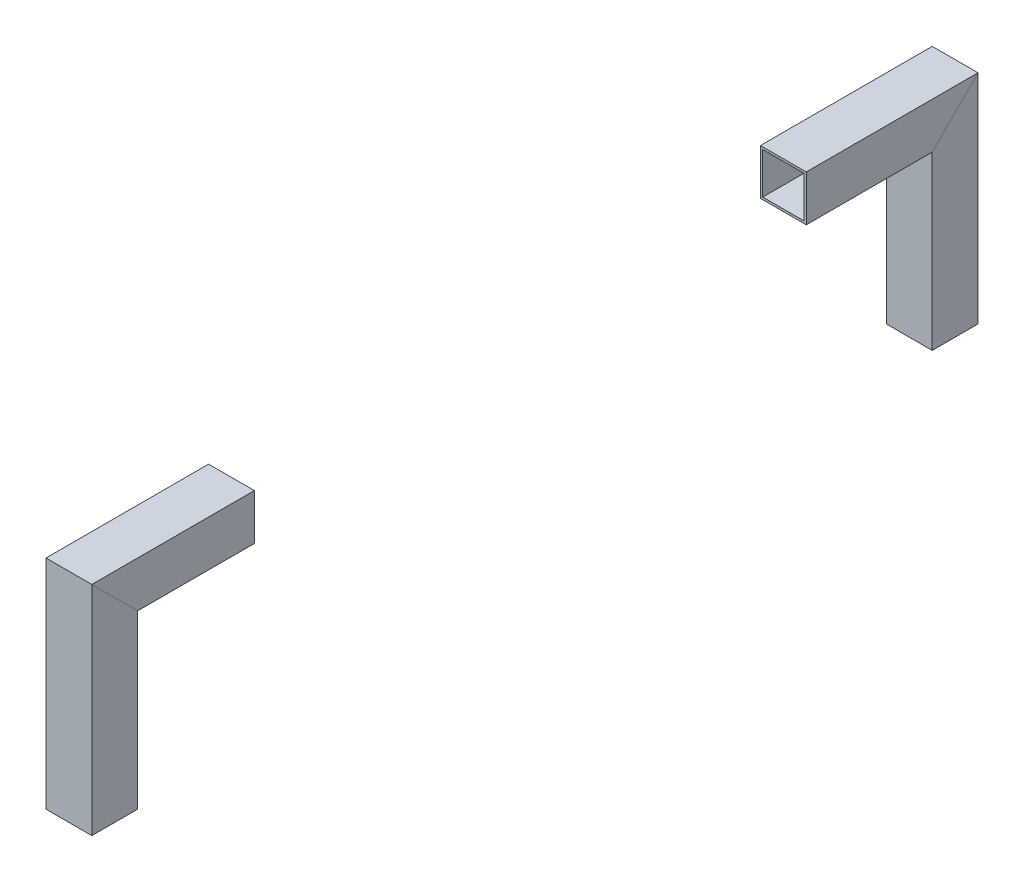
ISO-10303-21;
HEADER;
FILE_DESCRIPTION(('STEP AP214'),'2;1');
FILE_NAME('part.step','',(''),(''),'','','');
FILE_SCHEMA(('AUTOMOTIVE_DESIGN { 1 0 10303 214 1 1 1 1 }'));
ENDSEC;
DATA;
#1=APPLICATION_CONTEXT('core data for automotive mechanical design processes');
#2=APPLICATION_PROTOCOL_DEFINITION('international standard','automotive_design',2000,#1);
#3=PRODUCT_CONTEXT('',#1,'mechanical');
#4=PRODUCT('Part','Part','',(#3));
#5=PRODUCT_RELATED_PRODUCT_CATEGORY('part','',(#4));
#6=PRODUCT_DEFINITION_FORMATION('','',#4);
#7=PRODUCT_DEFINITION_CONTEXT('part definition',#1,'design');
#8=PRODUCT_DEFINITION('design','',#6,#7);
#9=PRODUCT_DEFINITION_SHAPE('','',#8);
#10=(LENGTH_UNIT() NAMED_UNIT(*) SI_UNIT(.MILLI.,.METRE.));
#11=(NAMED_UNIT(*) PLANE_ANGLE_UNIT() SI_UNIT($,.RADIAN.));
#12=(NAMED_UNIT(*) SI_UNIT($,.STERADIAN.) SOLID_ANGLE_UNIT());
#13=UNCERTAINTY_MEASURE_WITH_UNIT(LENGTH_MEASURE(1.E-05),#10,'distance_accuracy_value','');
#14=(GEOMETRIC_REPRESENTATION_CONTEXT(3) GLOBAL_UNCERTAINTY_ASSIGNED_CONTEXT((#13)) GLOBAL_UNIT_ASSIGNED_CONTEXT((#10,
#11,#12)) REPRESENTATION_CONTEXT('',''));
#15=CARTESIAN_POINT('',(0.,0.,0.));
#16=DIRECTION('',(0.,0.,1.));
#17=DIRECTION('',(1.,0.,0.));
#18=AXIS2_PLACEMENT_3D('',#15,#16,#17);
#19=CARTESIAN_POINT('',(-10.,95.,-367.));
#20=DIRECTION('',(0.,-1.,0.));
#21=DIRECTION('',(0.,0.,-1.));
#22=AXIS2_PLACEMENT_3D('',#19,#20,#21);
#23=PLANE('',#22);
#24=DIRECTION('',(0.,0.,1.));
#25=VECTOR('',#24,1.);
#26=CARTESIAN_POINT('',(10.,95.,-367.));
#27=LINE('',#26,#25);
#28=CARTESIAN_POINT('',(10.,95.,-61.));
#29=VERTEX_POINT('',#28);
#30=CARTESIAN_POINT('',(10.,95.,9.99999999999995));
#31=VERTEX_POINT('',#30);
#32=EDGE_CURVE('E163',#29,#31,#27,.T.);
#33=ORIENTED_EDGE('',*,*,#32,.F.);
#34=DIRECTION('',(1.,0.,0.));
#35=VECTOR('',#34,1.);
#36=CARTESIAN_POINT('',(-10.,95.,-61.));
#37=LINE('',#36,#35);
#38=CARTESIAN_POINT('',(-10.,95.,-61.));
#39=VERTEX_POINT('',#38);
#40=EDGE_CURVE('E13',#39,#29,#37,.T.);
#41=ORIENTED_EDGE('',*,*,#40,.F.);
#42=DIRECTION('',(0.,0.,1.));
#43=VECTOR('',#42,1.);
#44=CARTESIAN_POINT('',(-10.,95.,-367.));
#45=LINE('',#44,#43);
#46=CARTESIAN_POINT('',(-10.,95.,9.99999999999995));
#47=VERTEX_POINT('',#46);
#48=EDGE_CURVE('E66',#39,#47,#45,.T.);
#49=ORIENTED_EDGE('',*,*,#48,.T.);
#50=DIRECTION('',(-1.,0.,0.));
#51=VECTOR('',#50,1.);
#52=CARTESIAN_POINT('',(-10.,95.,9.99999999999995));
#53=LINE('',#52,#51);
#54=EDGE_CURVE('E188',#31,#47,#53,.T.);
#55=ORIENTED_EDGE('',*,*,#54,.F.);
#56=EDGE_LOOP('',(#33,#41,#49,#55));
#57=FACE_BOUND('',#56,.T.);
#58=ADVANCED_FACE('F62',(#57),#23,.F.);
#59=CARTESIAN_POINT('',(10.,75.,-367.));
#60=DIRECTION('',(-1.,0.,0.));
#61=DIRECTION('',(0.,0.,1.));
#62=AXIS2_PLACEMENT_3D('',#59,#60,#61);
#63=PLANE('',#62);
#64=DIRECTION('',(0.,0.,1.));
#65=VECTOR('',#64,1.);
#66=CARTESIAN_POINT('',(10.,75.,-367.));
#67=LINE('',#66,#65);
#68=CARTESIAN_POINT('',(10.,75.,-61.));
#69=VERTEX_POINT('',#68);
#70=CARTESIAN_POINT('',(10.,75.,-10.));
#71=VERTEX_POINT('',#70);
#72=EDGE_CURVE('E166',#69,#71,#67,.T.);
#73=ORIENTED_EDGE('',*,*,#72,.F.);
#74=DIRECTION('',(0.,-1.,0.));
#75=VECTOR('',#74,1.);
#76=CARTESIAN_POINT('',(10.,75.,-61.));
#77=LINE('',#76,#75);
#78=EDGE_CURVE('E72',#29,#69,#77,.T.);
#79=ORIENTED_EDGE('',*,*,#78,.F.);
#80=ORIENTED_EDGE('',*,*,#32,.T.);
#81=DIRECTION('',(0.,0.707106781186548,0.707106781186547));
#82=VECTOR('',#81,1.);
#83=CARTESIAN_POINT('',(10.,-103.5,-188.5));
#84=LINE('',#83,#82);
#85=EDGE_CURVE('E134',#71,#31,#84,.T.);
#86=ORIENTED_EDGE('',*,*,#85,.F.);
#87=EDGE_LOOP('',(#73,#79,#80,#86));
#88=FACE_BOUND('',#87,.T.);
#89=ADVANCED_FACE('F217',(#88),#63,.F.);
#90=CARTESIAN_POINT('',(-10.,75.,-367.));
#91=DIRECTION('',(0.,1.,0.));
#92=DIRECTION('',(0.,0.,1.));
#93=AXIS2_PLACEMENT_3D('',#90,#91,#92);
#94=PLANE('',#93);
#95=DIRECTION('',(0.,0.,1.));
#96=VECTOR('',#95,1.);
#97=CARTESIAN_POINT('',(-10.,75.,-367.));
#98=LINE('',#97,#96);
#99=CARTESIAN_POINT('',(-10.,75.,-61.));
#100=VERTEX_POINT('',#99);
#101=CARTESIAN_POINT('',(-10.,75.,-10.0000000000001));
#102=VERTEX_POINT('',#101);
#103=EDGE_CURVE('E162',#100,#102,#98,.T.);
#104=ORIENTED_EDGE('',*,*,#103,.F.);
#105=DIRECTION('',(1.,0.,0.));
#106=VECTOR('',#105,1.);
#107=CARTESIAN_POINT('',(-10.,75.,-61.));
#108=LINE('',#107,#106);
#109=EDGE_CURVE('E165',#100,#69,#108,.T.);
#110=ORIENTED_EDGE('',*,*,#109,.T.);
#111=ORIENTED_EDGE('',*,*,#72,.T.);
#112=DIRECTION('',(1.,0.,0.));
#113=VECTOR('',#112,1.);
#114=CARTESIAN_POINT('',(-10.,75.,-10.0000000000001));
#115=LINE('',#114,#113);
#116=EDGE_CURVE('E178',#102,#71,#115,.T.);
#117=ORIENTED_EDGE('',*,*,#116,.F.);
#118=EDGE_LOOP('',(#104,#110,#111,#117));
#119=FACE_BOUND('',#118,.T.);
#120=ADVANCED_FACE('F175',(#119),#94,.F.);
#121=CARTESIAN_POINT('',(-10.,75.,-367.));
#122=DIRECTION('',(1.,0.,0.));
#123=DIRECTION('',(0.,0.,-1.));
#124=AXIS2_PLACEMENT_3D('',#121,#122,#123);
#125=PLANE('',#124);
#126=ORIENTED_EDGE('',*,*,#48,.F.);
#127=DIRECTION('',(0.,-1.,0.));
#128=VECTOR('',#127,1.);
#129=CARTESIAN_POINT('',(-10.,75.,-61.));
#130=LINE('',#129,#128);
#131=EDGE_CURVE('E154',#39,#100,#130,.T.);
#132=ORIENTED_EDGE('',*,*,#131,.T.);
#133=ORIENTED_EDGE('',*,*,#103,.T.);
#134=DIRECTION('',(0.,-0.707106781186548,-0.707106781186547));
#135=VECTOR('',#134,1.);
#136=CARTESIAN_POINT('',(-10.,-103.5,-188.5));
#137=LINE('',#136,#135);
#138=EDGE_CURVE('E183',#47,#102,#137,.T.);
#139=ORIENTED_EDGE('',*,*,#138,.F.);
#140=EDGE_LOOP('',(#126,#132,#133,#139));
#141=FACE_BOUND('',#140,.T.);
#142=ADVANCED_FACE('F173',(#141),#125,.F.);
#143=CARTESIAN_POINT('',(-9.,94.,-367.));
#144=DIRECTION('',(0.,-1.,0.));
#145=DIRECTION('',(0.,0.,-1.));
#146=AXIS2_PLACEMENT_3D('',#143,#144,#145);
#147=PLANE('',#146);
#148=DIRECTION('',(-1.,0.,0.));
#149=VECTOR('',#148,1.);
#150=CARTESIAN_POINT('',(-9.,94.,-61.));
#151=LINE('',#150,#149);
#152=CARTESIAN_POINT('',(9.,94.,-61.));
#153=VERTEX_POINT('',#152);
#154=CARTESIAN_POINT('',(-9.,94.,-61.));
#155=VERTEX_POINT('',#154);
#156=EDGE_CURVE('E127',#153,#155,#151,.T.);
#157=ORIENTED_EDGE('',*,*,#156,.F.);
#158=DIRECTION('',(0.,0.,1.));
#159=VECTOR('',#158,1.);
#160=CARTESIAN_POINT('',(9.,94.,-367.));
#161=LINE('',#160,#159);
#162=CARTESIAN_POINT('',(9.,94.,9.00000000000001));
#163=VERTEX_POINT('',#162);
#164=EDGE_CURVE('E150',#153,#163,#161,.T.);
#165=ORIENTED_EDGE('',*,*,#164,.T.);
#166=DIRECTION('',(-1.,0.,0.));
#167=VECTOR('',#166,1.);
#168=CARTESIAN_POINT('',(-9.,94.,9.00000000000001));
#169=LINE('',#168,#167);
#170=CARTESIAN_POINT('',(-9.,94.,9.00000000000001));
#171=VERTEX_POINT('',#170);
#172=EDGE_CURVE('E146',#163,#171,#169,.T.);
#173=ORIENTED_EDGE('',*,*,#172,.T.);
#174=DIRECTION('',(0.,0.,1.));
#175=VECTOR('',#174,1.);
#176=CARTESIAN_POINT('',(-9.,94.,-367.));
#177=LINE('',#176,#175);
#178=EDGE_CURVE('E140',#155,#171,#177,.T.);
#179=ORIENTED_EDGE('',*,*,#178,.F.);
#180=EDGE_LOOP('',(#157,#165,#173,#179));
#181=FACE_BOUND('',#180,.T.);
#182=ADVANCED_FACE('F64',(#181),#147,.T.);
#183=CARTESIAN_POINT('',(-9.,76.,-367.));
#184=DIRECTION('',(1.,0.,0.));
#185=DIRECTION('',(0.,0.,-1.));
#186=AXIS2_PLACEMENT_3D('',#183,#184,#185);
#187=PLANE('',#186);
#188=DIRECTION('',(0.,-1.,0.));
#189=VECTOR('',#188,1.);
#190=CARTESIAN_POINT('',(-9.,76.,-61.));
#191=LINE('',#190,#189);
#192=CARTESIAN_POINT('',(-9.,76.,-61.));
#193=VERTEX_POINT('',#192);
#194=EDGE_CURVE('E130',#155,#193,#191,.T.);
#195=ORIENTED_EDGE('',*,*,#194,.F.);
#196=ORIENTED_EDGE('',*,*,#178,.T.);
#197=DIRECTION('',(0.,-0.707106781186548,-0.707106781186547));
#198=VECTOR('',#197,1.);
#199=CARTESIAN_POINT('',(-9.,-103.,-188.));
#200=LINE('',#199,#198);
#201=CARTESIAN_POINT('',(-9.,76.,-9.00000000000006));
#202=VERTEX_POINT('',#201);
#203=EDGE_CURVE('E147',#171,#202,#200,.T.);
#204=ORIENTED_EDGE('',*,*,#203,.T.);
#205=DIRECTION('',(0.,0.,1.));
#206=VECTOR('',#205,1.);
#207=CARTESIAN_POINT('',(-9.,76.,-367.));
#208=LINE('',#207,#206);
#209=EDGE_CURVE('E142',#193,#202,#208,.T.);
#210=ORIENTED_EDGE('',*,*,#209,.F.);
#211=EDGE_LOOP('',(#195,#196,#204,#210));
#212=FACE_BOUND('',#211,.T.);
#213=ADVANCED_FACE('F138',(#212),#187,.T.);
#214=CARTESIAN_POINT('',(-9.,76.,-367.));
#215=DIRECTION('',(0.,1.,0.));
#216=DIRECTION('',(0.,0.,1.));
#217=AXIS2_PLACEMENT_3D('',#214,#215,#216);
#218=PLANE('',#217);
#219=DIRECTION('',(1.,0.,0.));
#220=VECTOR('',#219,1.);
#221=CARTESIAN_POINT('',(-9.,76.,-61.));
#222=LINE('',#221,#220);
#223=CARTESIAN_POINT('',(9.,76.,-61.));
#224=VERTEX_POINT('',#223);
#225=EDGE_CURVE('E100',#193,#224,#222,.T.);
#226=ORIENTED_EDGE('',*,*,#225,.F.);
#227=ORIENTED_EDGE('',*,*,#209,.T.);
#228=DIRECTION('',(1.,0.,0.));
#229=VECTOR('',#228,1.);
#230=CARTESIAN_POINT('',(-9.,76.,-9.00000000000001));
#231=LINE('',#230,#229);
#232=CARTESIAN_POINT('',(9.,76.,-9.00000000000001));
#233=VERTEX_POINT('',#232);
#234=EDGE_CURVE('E157',#202,#233,#231,.T.);
#235=ORIENTED_EDGE('',*,*,#234,.T.);
#236=DIRECTION('',(0.,0.,1.));
#237=VECTOR('',#236,1.);
#238=CARTESIAN_POINT('',(9.,76.,-367.));
#239=LINE('',#238,#237);
#240=EDGE_CURVE('E158',#224,#233,#239,.T.);
#241=ORIENTED_EDGE('',*,*,#240,.F.);
#242=EDGE_LOOP('',(#226,#227,#235,#241));
#243=FACE_BOUND('',#242,.T.);
#244=ADVANCED_FACE('F202',(#243),#218,.T.);
#245=CARTESIAN_POINT('',(9.,76.,-367.));
#246=DIRECTION('',(-1.,0.,0.));
#247=DIRECTION('',(0.,0.,1.));
#248=AXIS2_PLACEMENT_3D('',#245,#246,#247);
#249=PLANE('',#248);
#250=DIRECTION('',(0.,1.,0.));
#251=VECTOR('',#250,1.);
#252=CARTESIAN_POINT('',(9.,76.,-61.));
#253=LINE('',#252,#251);
#254=EDGE_CURVE('E94',#224,#153,#253,.T.);
#255=ORIENTED_EDGE('',*,*,#254,.F.);
#256=ORIENTED_EDGE('',*,*,#240,.T.);
#257=DIRECTION('',(0.,0.707106781186548,0.707106781186547));
#258=VECTOR('',#257,1.);
#259=CARTESIAN_POINT('',(9.,-103.,-188.));
#260=LINE('',#259,#258);
#261=EDGE_CURVE('E160',#233,#163,#260,.T.);
#262=ORIENTED_EDGE('',*,*,#261,.T.);
#263=ORIENTED_EDGE('',*,*,#164,.F.);
#264=EDGE_LOOP('',(#255,#256,#262,#263));
#265=FACE_BOUND('',#264,.T.);
#266=ADVANCED_FACE('F206',(#265),#249,.T.);
#267=CARTESIAN_POINT('',(0.,85.,0.));
#268=DIRECTION('',(0.,-0.707106781186547,0.707106781186548));
#269=DIRECTION('',(0.,-0.707106781186548,-0.707106781186547));
#270=AXIS2_PLACEMENT_3D('',#267,#268,#269);
#271=PLANE('',#270);
#272=ORIENTED_EDGE('',*,*,#261,.F.);
#273=ORIENTED_EDGE('',*,*,#234,.F.);
#274=ORIENTED_EDGE('',*,*,#203,.F.);
#275=ORIENTED_EDGE('',*,*,#172,.F.);
#276=EDGE_LOOP('',(#272,#273,#274,#275));
#277=FACE_BOUND('',#276,.T.);
#278=ORIENTED_EDGE('',*,*,#54,.T.);
#279=ORIENTED_EDGE('',*,*,#138,.T.);
#280=ORIENTED_EDGE('',*,*,#116,.T.);
#281=ORIENTED_EDGE('',*,*,#85,.T.);
#282=EDGE_LOOP('',(#278,#279,#280,#281));
#283=FACE_BOUND('',#282,.T.);
#284=ADVANCED_FACE('F186',(#277,#283),#271,.T.);
#285=CARTESIAN_POINT('',(-10.,75.,-61.));
#286=DIRECTION('',(0.,0.,1.));
#287=DIRECTION('',(1.,0.,0.));
#288=AXIS2_PLACEMENT_3D('',#285,#286,#287);
#289=PLANE('',#288);
#290=ORIENTED_EDGE('',*,*,#156,.T.);
#291=ORIENTED_EDGE('',*,*,#194,.T.);
#292=ORIENTED_EDGE('',*,*,#225,.T.);
#293=ORIENTED_EDGE('',*,*,#254,.T.);
#294=EDGE_LOOP('',(#290,#291,#292,#293));
#295=FACE_BOUND('',#294,.T.);
#296=ORIENTED_EDGE('',*,*,#78,.T.);
#297=ORIENTED_EDGE('',*,*,#109,.F.);
#298=ORIENTED_EDGE('',*,*,#131,.F.);
#299=ORIENTED_EDGE('',*,*,#40,.T.);
#300=EDGE_LOOP('',(#296,#297,#298,#299));
#301=FACE_BOUND('',#300,.T.);
#302=ADVANCED_FACE('F129',(#295,#301),#289,.F.);
#303=CLOSED_SHELL('',(#58,#89,#120,#142,#182,#213,#244,#266,#284,#302));
#304=MANIFOLD_SOLID_BREP('B2',#303);
#305=CARTESIAN_POINT('',(-10.,85.,-10.));
#306=DIRECTION('',(1.,0.,0.));
#307=DIRECTION('',(0.,0.,-1.));
#308=AXIS2_PLACEMENT_3D('',#305,#306,#307);
#309=PLANE('',#308);
#310=DIRECTION('',(0.,0.707106781186548,0.707106781186548));
#311=VECTOR('',#310,1.);
#312=CARTESIAN_POINT('',(-10.,80.,-5.));
#313=LINE('',#312,#311);
#314=CARTESIAN_POINT('',(-10.,75.,-10.));
#315=VERTEX_POINT('',#314);
#316=CARTESIAN_POINT('',(-10.,95.,10.));
#317=VERTEX_POINT('',#316);
#318=EDGE_CURVE('E409',#315,#317,#313,.T.);
#319=ORIENTED_EDGE('',*,*,#318,.F.);
#320=DIRECTION('',(0.,-1.,0.));
#321=VECTOR('',#320,1.);
#322=CARTESIAN_POINT('',(-10.,85.,-10.));
#323=LINE('',#322,#321);
#324=CARTESIAN_POINT('',(-10.,0.,-10.));
#325=VERTEX_POINT('',#324);
#326=EDGE_CURVE('E349',#315,#325,#323,.T.);
#327=ORIENTED_EDGE('',*,*,#326,.T.);
#328=DIRECTION('',(0.,0.,1.));
#329=VECTOR('',#328,1.);
#330=CARTESIAN_POINT('',(-10.,0.,-10.));
#331=LINE('',#330,#329);
#332=CARTESIAN_POINT('',(-10.,0.,10.));
#333=VERTEX_POINT('',#332);
#334=EDGE_CURVE('E452',#325,#333,#331,.T.);
#335=ORIENTED_EDGE('',*,*,#334,.T.);
#336=DIRECTION('',(0.,-1.,0.));
#337=VECTOR('',#336,1.);
#338=CARTESIAN_POINT('',(-10.,85.,10.));
#339=LINE('',#338,#337);
#340=EDGE_CURVE('E427',#317,#333,#339,.T.);
#341=ORIENTED_EDGE('',*,*,#340,.F.);
#342=EDGE_LOOP('',(#319,#327,#335,#341));
#343=FACE_BOUND('',#342,.T.);
#344=ADVANCED_FACE('F334',(#343),#309,.F.);
#345=CARTESIAN_POINT('',(-10.,85.,-10.));
#346=DIRECTION('',(0.,0.,1.));
#347=DIRECTION('',(1.,0.,0.));
#348=AXIS2_PLACEMENT_3D('',#345,#346,#347);
#349=PLANE('',#348);
#350=DIRECTION('',(-1.,0.,0.));
#351=VECTOR('',#350,1.);
#352=CARTESIAN_POINT('',(-10.,75.,-10.));
#353=LINE('',#352,#351);
#354=CARTESIAN_POINT('',(10.,75.,-10.));
#355=VERTEX_POINT('',#354);
#356=EDGE_CURVE('E437',#355,#315,#353,.T.);
#357=ORIENTED_EDGE('',*,*,#356,.F.);
#358=DIRECTION('',(0.,-1.,0.));
#359=VECTOR('',#358,1.);
#360=CARTESIAN_POINT('',(10.,85.,-10.));
#361=LINE('',#360,#359);
#362=CARTESIAN_POINT('',(10.,0.,-10.));
#363=VERTEX_POINT('',#362);
#364=EDGE_CURVE('E421',#355,#363,#361,.T.);
#365=ORIENTED_EDGE('',*,*,#364,.T.);
#366=DIRECTION('',(-1.,0.,0.));
#367=VECTOR('',#366,1.);
#368=CARTESIAN_POINT('',(-10.,0.,-10.));
#369=LINE('',#368,#367);
#370=EDGE_CURVE('E434',#363,#325,#369,.T.);
#371=ORIENTED_EDGE('',*,*,#370,.T.);
#372=ORIENTED_EDGE('',*,*,#326,.F.);
#373=EDGE_LOOP('',(#357,#365,#371,#372));
#374=FACE_BOUND('',#373,.T.);
#375=ADVANCED_FACE('F432',(#374),#349,.F.);
#376=CARTESIAN_POINT('',(10.,85.,-10.));
#377=DIRECTION('',(-1.,0.,0.));
#378=DIRECTION('',(0.,0.,1.));
#379=AXIS2_PLACEMENT_3D('',#376,#377,#378);
#380=PLANE('',#379);
#381=DIRECTION('',(0.,-0.707106781186548,-0.707106781186548));
#382=VECTOR('',#381,1.);
#383=CARTESIAN_POINT('',(10.,80.,-5.));
#384=LINE('',#383,#382);
#385=CARTESIAN_POINT('',(10.,95.,10.));
#386=VERTEX_POINT('',#385);
#387=EDGE_CURVE('E474',#386,#355,#384,.T.);
#388=ORIENTED_EDGE('',*,*,#387,.F.);
#389=DIRECTION('',(0.,-1.,0.));
#390=VECTOR('',#389,1.);
#391=CARTESIAN_POINT('',(10.,85.,10.));
#392=LINE('',#391,#390);
#393=CARTESIAN_POINT('',(10.,0.,10.));
#394=VERTEX_POINT('',#393);
#395=EDGE_CURVE('E417',#386,#394,#392,.T.);
#396=ORIENTED_EDGE('',*,*,#395,.T.);
#397=DIRECTION('',(0.,0.,-1.));
#398=VECTOR('',#397,1.);
#399=CARTESIAN_POINT('',(10.,0.,-10.));
#400=LINE('',#399,#398);
#401=EDGE_CURVE('E441',#394,#363,#400,.T.);
#402=ORIENTED_EDGE('',*,*,#401,.T.);
#403=ORIENTED_EDGE('',*,*,#364,.F.);
#404=EDGE_LOOP('',(#388,#396,#402,#403));
#405=FACE_BOUND('',#404,.T.);
#406=ADVANCED_FACE('F442',(#405),#380,.F.);
#407=CARTESIAN_POINT('',(-10.,85.,10.));
#408=DIRECTION('',(0.,0.,-1.));
#409=DIRECTION('',(-1.,0.,0.));
#410=AXIS2_PLACEMENT_3D('',#407,#408,#409);
#411=PLANE('',#410);
#412=DIRECTION('',(1.,0.,0.));
#413=VECTOR('',#412,1.);
#414=CARTESIAN_POINT('',(-10.,95.,10.));
#415=LINE('',#414,#413);
#416=EDGE_CURVE('E476',#317,#386,#415,.T.);
#417=ORIENTED_EDGE('',*,*,#416,.F.);
#418=ORIENTED_EDGE('',*,*,#340,.T.);
#419=DIRECTION('',(1.,0.,0.));
#420=VECTOR('',#419,1.);
#421=CARTESIAN_POINT('',(-10.,0.,10.));
#422=LINE('',#421,#420);
#423=EDGE_CURVE('E447',#333,#394,#422,.T.);
#424=ORIENTED_EDGE('',*,*,#423,.T.);
#425=ORIENTED_EDGE('',*,*,#395,.F.);
#426=EDGE_LOOP('',(#417,#418,#424,#425));
#427=FACE_BOUND('',#426,.T.);
#428=ADVANCED_FACE('F336',(#427),#411,.F.);
#429=CARTESIAN_POINT('',(0.,0.,0.));
#430=DIRECTION('',(0.,-1.,0.));
#431=DIRECTION('',(0.,0.,-1.));
#432=AXIS2_PLACEMENT_3D('',#429,#430,#431);
#433=PLANE('',#432);
#434=ORIENTED_EDGE('',*,*,#423,.F.);
#435=ORIENTED_EDGE('',*,*,#334,.F.);
#436=ORIENTED_EDGE('',*,*,#370,.F.);
#437=ORIENTED_EDGE('',*,*,#401,.F.);
#438=EDGE_LOOP('',(#434,#435,#436,#437));
#439=FACE_BOUND('',#438,.T.);
#440=DIRECTION('',(1.,0.,0.));
#441=VECTOR('',#440,1.);
#442=CARTESIAN_POINT('',(-9.,0.,9.));
#443=LINE('',#442,#441);
#444=CARTESIAN_POINT('',(-9.,0.,9.));
#445=VERTEX_POINT('',#444);
#446=CARTESIAN_POINT('',(9.,0.,9.));
#447=VERTEX_POINT('',#446);
#448=EDGE_CURVE('E454',#445,#447,#443,.T.);
#449=ORIENTED_EDGE('',*,*,#448,.T.);
#450=DIRECTION('',(0.,0.,-1.));
#451=VECTOR('',#450,1.);
#452=CARTESIAN_POINT('',(9.,0.,-9.00000000000001));
#453=LINE('',#452,#451);
#454=CARTESIAN_POINT('',(9.,0.,-9.00000000000001));
#455=VERTEX_POINT('',#454);
#456=EDGE_CURVE('E415',#447,#455,#453,.T.);
#457=ORIENTED_EDGE('',*,*,#456,.T.);
#458=DIRECTION('',(-1.,0.,0.));
#459=VECTOR('',#458,1.);
#460=CARTESIAN_POINT('',(-9.,0.,-9.00000000000001));
#461=LINE('',#460,#459);
#462=CARTESIAN_POINT('',(-9.,0.,-9.00000000000001));
#463=VERTEX_POINT('',#462);
#464=EDGE_CURVE('E461',#455,#463,#461,.T.);
#465=ORIENTED_EDGE('',*,*,#464,.T.);
#466=DIRECTION('',(0.,0.,1.));
#467=VECTOR('',#466,1.);
#468=CARTESIAN_POINT('',(-9.,0.,-9.00000000000001));
#469=LINE('',#468,#467);
#470=EDGE_CURVE('E459',#463,#445,#469,.T.);
#471=ORIENTED_EDGE('',*,*,#470,.T.);
#472=EDGE_LOOP('',(#449,#457,#465,#471));
#473=FACE_BOUND('',#472,.T.);
#474=ADVANCED_FACE('F449',(#439,#473),#433,.T.);
#475=CARTESIAN_POINT('',(9.,85.,-9.00000000000001));
#476=DIRECTION('',(-1.,0.,0.));
#477=DIRECTION('',(0.,0.,1.));
#478=AXIS2_PLACEMENT_3D('',#475,#476,#477);
#479=PLANE('',#478);
#480=DIRECTION('',(0.,-1.,0.));
#481=VECTOR('',#480,1.);
#482=CARTESIAN_POINT('',(9.,85.,9.));
#483=LINE('',#482,#481);
#484=CARTESIAN_POINT('',(9.,94.,9.));
#485=VERTEX_POINT('',#484);
#486=EDGE_CURVE('E406',#485,#447,#483,.T.);
#487=ORIENTED_EDGE('',*,*,#486,.F.);
#488=DIRECTION('',(0.,-0.707106781186548,-0.707106781186548));
#489=VECTOR('',#488,1.);
#490=CARTESIAN_POINT('',(9.,80.5,-4.5));
#491=LINE('',#490,#489);
#492=CARTESIAN_POINT('',(9.,76.,-9.00000000000001));
#493=VERTEX_POINT('',#492);
#494=EDGE_CURVE('E60',#485,#493,#491,.T.);
#495=ORIENTED_EDGE('',*,*,#494,.T.);
#496=DIRECTION('',(0.,-1.,0.));
#497=VECTOR('',#496,1.);
#498=CARTESIAN_POINT('',(9.,85.,-9.00000000000001));
#499=LINE('',#498,#497);
#500=EDGE_CURVE('E416',#493,#455,#499,.T.);
#501=ORIENTED_EDGE('',*,*,#500,.T.);
#502=ORIENTED_EDGE('',*,*,#456,.F.);
#503=EDGE_LOOP('',(#487,#495,#501,#502));
#504=FACE_BOUND('',#503,.T.);
#505=ADVANCED_FACE('F413',(#504),#479,.T.);
#506=CARTESIAN_POINT('',(-9.,85.,-9.00000000000001));
#507=DIRECTION('',(0.,0.,1.));
#508=DIRECTION('',(1.,0.,0.));
#509=AXIS2_PLACEMENT_3D('',#506,#507,#508);
#510=PLANE('',#509);
#511=ORIENTED_EDGE('',*,*,#500,.F.);
#512=DIRECTION('',(-1.,0.,0.));
#513=VECTOR('',#512,1.);
#514=CARTESIAN_POINT('',(-9.,76.,-9.));
#515=LINE('',#514,#513);
#516=CARTESIAN_POINT('',(-9.,76.,-9.));
#517=VERTEX_POINT('',#516);
#518=EDGE_CURVE('E357',#493,#517,#515,.T.);
#519=ORIENTED_EDGE('',*,*,#518,.T.);
#520=DIRECTION('',(0.,-1.,0.));
#521=VECTOR('',#520,1.);
#522=CARTESIAN_POINT('',(-9.,85.,-9.00000000000001));
#523=LINE('',#522,#521);
#524=EDGE_CURVE('E419',#517,#463,#523,.T.);
#525=ORIENTED_EDGE('',*,*,#524,.T.);
#526=ORIENTED_EDGE('',*,*,#464,.F.);
#527=EDGE_LOOP('',(#511,#519,#525,#526));
#528=FACE_BOUND('',#527,.T.);
#529=ADVANCED_FACE('F505',(#528),#510,.T.);
#530=CARTESIAN_POINT('',(-9.,85.,-9.00000000000001));
#531=DIRECTION('',(1.,0.,0.));
#532=DIRECTION('',(0.,0.,-1.));
#533=AXIS2_PLACEMENT_3D('',#530,#531,#532);
#534=PLANE('',#533);
#535=ORIENTED_EDGE('',*,*,#524,.F.);
#536=DIRECTION('',(0.,0.707106781186548,0.707106781186548));
#537=VECTOR('',#536,1.);
#538=CARTESIAN_POINT('',(-9.,80.5,-4.5));
#539=LINE('',#538,#537);
#540=CARTESIAN_POINT('',(-9.,94.,9.));
#541=VERTEX_POINT('',#540);
#542=EDGE_CURVE('E410',#517,#541,#539,.T.);
#543=ORIENTED_EDGE('',*,*,#542,.T.);
#544=DIRECTION('',(0.,-1.,0.));
#545=VECTOR('',#544,1.);
#546=CARTESIAN_POINT('',(-9.,85.,9.));
#547=LINE('',#546,#545);
#548=EDGE_CURVE('E342',#541,#445,#547,.T.);
#549=ORIENTED_EDGE('',*,*,#548,.T.);
#550=ORIENTED_EDGE('',*,*,#470,.F.);
#551=EDGE_LOOP('',(#535,#543,#549,#550));
#552=FACE_BOUND('',#551,.T.);
#553=ADVANCED_FACE('F467',(#552),#534,.T.);
#554=CARTESIAN_POINT('',(-9.,85.,9.));
#555=DIRECTION('',(0.,0.,-1.));
#556=DIRECTION('',(-1.,0.,0.));
#557=AXIS2_PLACEMENT_3D('',#554,#555,#556);
#558=PLANE('',#557);
#559=ORIENTED_EDGE('',*,*,#548,.F.);
#560=DIRECTION('',(1.,0.,0.));
#561=VECTOR('',#560,1.);
#562=CARTESIAN_POINT('',(-9.,94.,9.));
#563=LINE('',#562,#561);
#564=EDGE_CURVE('E399',#541,#485,#563,.T.);
#565=ORIENTED_EDGE('',*,*,#564,.T.);
#566=ORIENTED_EDGE('',*,*,#486,.T.);
#567=ORIENTED_EDGE('',*,*,#448,.F.);
#568=EDGE_LOOP('',(#559,#565,#566,#567));
#569=FACE_BOUND('',#568,.T.);
#570=ADVANCED_FACE('F404',(#569),#558,.T.);
#571=CARTESIAN_POINT('',(0.,85.,0.));
#572=DIRECTION('',(0.,0.707106781186548,-0.707106781186548));
#573=DIRECTION('',(0.,0.707106781186548,0.707106781186548));
#574=AXIS2_PLACEMENT_3D('',#571,#572,#573);
#575=PLANE('',#574);
#576=ORIENTED_EDGE('',*,*,#564,.F.);
#577=ORIENTED_EDGE('',*,*,#542,.F.);
#578=ORIENTED_EDGE('',*,*,#518,.F.);
#579=ORIENTED_EDGE('',*,*,#494,.F.);
#580=EDGE_LOOP('',(#576,#577,#578,#579));
#581=FACE_BOUND('',#580,.T.);
#582=ORIENTED_EDGE('',*,*,#318,.T.);
#583=ORIENTED_EDGE('',*,*,#416,.T.);
#584=ORIENTED_EDGE('',*,*,#387,.T.);
#585=ORIENTED_EDGE('',*,*,#356,.T.);
#586=EDGE_LOOP('',(#582,#583,#584,#585));
#587=FACE_BOUND('',#586,.T.);
#588=ADVANCED_FACE('F397',(#581,#587),#575,.T.);
#589=CLOSED_SHELL('',(#344,#375,#406,#428,#474,#505,#529,#553,#570,#588));
#590=MANIFOLD_SOLID_BREP('B7',#589);
#591=CARTESIAN_POINT('',(-10.,75.,-367.));
#592=DIRECTION('',(1.,0.,0.));
#593=DIRECTION('',(0.,0.,-1.));
#594=AXIS2_PLACEMENT_3D('',#591,#592,#593);
#595=PLANE('',#594);
#596=DIRECTION('',(0.,0.,1.));
#597=VECTOR('',#596,1.);
#598=CARTESIAN_POINT('',(-10.,75.,-367.));
#599=LINE('',#598,#597);
#600=CARTESIAN_POINT('',(-10.,75.,-357.));
#601=VERTEX_POINT('',#600);
#602=CARTESIAN_POINT('',(-10.,75.,-302.));
#603=VERTEX_POINT('',#602);
#604=EDGE_CURVE('E661',#601,#603,#599,.T.);
#605=ORIENTED_EDGE('',*,*,#604,.T.);
#606=DIRECTION('',(0.,1.,0.));
#607=VECTOR('',#606,1.);
#608=CARTESIAN_POINT('',(-10.,75.,-302.));
#609=LINE('',#608,#607);
#610=CARTESIAN_POINT('',(-10.,95.,-302.));
#611=VERTEX_POINT('',#610);
#612=EDGE_CURVE('E648',#603,#611,#609,.T.);
#613=ORIENTED_EDGE('',*,*,#612,.T.);
#614=DIRECTION('',(0.,0.,1.));
#615=VECTOR('',#614,1.);
#616=CARTESIAN_POINT('',(-10.,95.,-367.));
#617=LINE('',#616,#615);
#618=CARTESIAN_POINT('',(-10.,95.,-377.));
#619=VERTEX_POINT('',#618);
#620=EDGE_CURVE('E669',#619,#611,#617,.T.);
#621=ORIENTED_EDGE('',*,*,#620,.F.);
#622=DIRECTION('',(0.,0.707106781186548,-0.707106781186547));
#623=VECTOR('',#622,1.);
#624=CARTESIAN_POINT('',(-10.,80.,-362.));
#625=LINE('',#624,#623);
#626=EDGE_CURVE('E667',#601,#619,#625,.T.);
#627=ORIENTED_EDGE('',*,*,#626,.F.);
#628=EDGE_LOOP('',(#605,#613,#621,#627));
#629=FACE_BOUND('',#628,.T.);
#630=ADVANCED_FACE('F587',(#629),#595,.F.);
#631=CARTESIAN_POINT('',(-10.,75.,-367.));
#632=DIRECTION('',(0.,1.,0.));
#633=DIRECTION('',(0.,0.,1.));
#634=AXIS2_PLACEMENT_3D('',#631,#632,#633);
#635=PLANE('',#634);
#636=DIRECTION('',(0.,0.,1.));
#637=VECTOR('',#636,1.);
#638=CARTESIAN_POINT('',(10.,75.,-367.));
#639=LINE('',#638,#637);
#640=CARTESIAN_POINT('',(10.,75.,-357.));
#641=VERTEX_POINT('',#640);
#642=CARTESIAN_POINT('',(10.,75.,-302.));
#643=VERTEX_POINT('',#642);
#644=EDGE_CURVE('E664',#641,#643,#639,.T.);
#645=ORIENTED_EDGE('',*,*,#644,.T.);
#646=DIRECTION('',(1.,0.,0.));
#647=VECTOR('',#646,1.);
#648=CARTESIAN_POINT('',(-10.,75.,-302.));
#649=LINE('',#648,#647);
#650=EDGE_CURVE('E651',#603,#643,#649,.T.);
#651=ORIENTED_EDGE('',*,*,#650,.F.);
#652=ORIENTED_EDGE('',*,*,#604,.F.);
#653=DIRECTION('',(-1.,0.,0.));
#654=VECTOR('',#653,1.);
#655=CARTESIAN_POINT('',(-10.,75.,-357.));
#656=LINE('',#655,#654);
#657=EDGE_CURVE('E702',#641,#601,#656,.T.);
#658=ORIENTED_EDGE('',*,*,#657,.F.);
#659=EDGE_LOOP('',(#645,#651,#652,#658));
#660=FACE_BOUND('',#659,.T.);
#661=ADVANCED_FACE('F660',(#660),#635,.F.);
#662=CARTESIAN_POINT('',(10.,75.,-367.));
#663=DIRECTION('',(-1.,0.,0.));
#664=DIRECTION('',(0.,0.,1.));
#665=AXIS2_PLACEMENT_3D('',#662,#663,#664);
#666=PLANE('',#665);
#667=DIRECTION('',(0.,0.,1.));
#668=VECTOR('',#667,1.);
#669=CARTESIAN_POINT('',(10.,95.,-367.));
#670=LINE('',#669,#668);
#671=CARTESIAN_POINT('',(10.,95.,-377.));
#672=VERTEX_POINT('',#671);
#673=CARTESIAN_POINT('',(10.,95.,-302.));
#674=VERTEX_POINT('',#673);
#675=EDGE_CURVE('E671',#672,#674,#670,.T.);
#676=ORIENTED_EDGE('',*,*,#675,.T.);
#677=DIRECTION('',(0.,1.,0.));
#678=VECTOR('',#677,1.);
#679=CARTESIAN_POINT('',(10.,75.,-302.));
#680=LINE('',#679,#678);
#681=EDGE_CURVE('E656',#643,#674,#680,.T.);
#682=ORIENTED_EDGE('',*,*,#681,.F.);
#683=ORIENTED_EDGE('',*,*,#644,.F.);
#684=DIRECTION('',(0.,-0.707106781186548,0.707106781186547));
#685=VECTOR('',#684,1.);
#686=CARTESIAN_POINT('',(10.,80.,-362.));
#687=LINE('',#686,#685);
#688=EDGE_CURVE('E699',#672,#641,#687,.T.);
#689=ORIENTED_EDGE('',*,*,#688,.F.);
#690=EDGE_LOOP('',(#676,#682,#683,#689));
#691=FACE_BOUND('',#690,.T.);
#692=ADVANCED_FACE('F723',(#691),#666,.F.);
#693=CARTESIAN_POINT('',(-10.,95.,-367.));
#694=DIRECTION('',(0.,-1.,0.));
#695=DIRECTION('',(0.,0.,-1.));
#696=AXIS2_PLACEMENT_3D('',#693,#694,#695);
#697=PLANE('',#696);
#698=ORIENTED_EDGE('',*,*,#620,.T.);
#699=DIRECTION('',(1.,0.,0.));
#700=VECTOR('',#699,1.);
#701=CARTESIAN_POINT('',(-10.,95.,-302.));
#702=LINE('',#701,#700);
#703=EDGE_CURVE('E602',#611,#674,#702,.T.);
#704=ORIENTED_EDGE('',*,*,#703,.T.);
#705=ORIENTED_EDGE('',*,*,#675,.F.);
#706=DIRECTION('',(1.,0.,0.));
#707=VECTOR('',#706,1.);
#708=CARTESIAN_POINT('',(-10.,95.,-377.));
#709=LINE('',#708,#707);
#710=EDGE_CURVE('E673',#619,#672,#709,.T.);
#711=ORIENTED_EDGE('',*,*,#710,.F.);
#712=EDGE_LOOP('',(#698,#704,#705,#711));
#713=FACE_BOUND('',#712,.T.);
#714=ADVANCED_FACE('F589',(#713),#697,.F.);
#715=CARTESIAN_POINT('',(0.,85.,-367.));
#716=DIRECTION('',(0.,-0.707106781186547,-0.707106781186548));
#717=DIRECTION('',(0.,0.707106781186548,-0.707106781186547));
#718=AXIS2_PLACEMENT_3D('',#715,#716,#717);
#719=PLANE('',#718);
#720=DIRECTION('',(1.,0.,0.));
#721=VECTOR('',#720,1.);
#722=CARTESIAN_POINT('',(-9.,94.,-376.));
#723=LINE('',#722,#721);
#724=CARTESIAN_POINT('',(-9.,94.,-376.));
#725=VERTEX_POINT('',#724);
#726=CARTESIAN_POINT('',(9.,94.,-376.));
#727=VERTEX_POINT('',#726);
#728=EDGE_CURVE('E705',#725,#727,#723,.T.);
#729=ORIENTED_EDGE('',*,*,#728,.F.);
#730=DIRECTION('',(0.,0.707106781186548,-0.707106781186547));
#731=VECTOR('',#730,1.);
#732=CARTESIAN_POINT('',(-9.,80.5,-362.5));
#733=LINE('',#732,#731);
#734=CARTESIAN_POINT('',(-9.,76.,-358.));
#735=VERTEX_POINT('',#734);
#736=EDGE_CURVE('E708',#735,#725,#733,.T.);
#737=ORIENTED_EDGE('',*,*,#736,.F.);
#738=DIRECTION('',(-1.,0.,0.));
#739=VECTOR('',#738,1.);
#740=CARTESIAN_POINT('',(-9.,76.,-358.));
#741=LINE('',#740,#739);
#742=CARTESIAN_POINT('',(9.,76.,-358.));
#743=VERTEX_POINT('',#742);
#744=EDGE_CURVE('E710',#743,#735,#741,.T.);
#745=ORIENTED_EDGE('',*,*,#744,.F.);
#746=DIRECTION('',(0.,-0.707106781186548,0.707106781186547));
#747=VECTOR('',#746,1.);
#748=CARTESIAN_POINT('',(9.,80.5,-362.5));
#749=LINE('',#748,#747);
#750=EDGE_CURVE('E595',#727,#743,#749,.T.);
#751=ORIENTED_EDGE('',*,*,#750,.F.);
#752=EDGE_LOOP('',(#729,#737,#745,#751));
#753=FACE_BOUND('',#752,.T.);
#754=ORIENTED_EDGE('',*,*,#626,.T.);
#755=ORIENTED_EDGE('',*,*,#710,.T.);
#756=ORIENTED_EDGE('',*,*,#688,.T.);
#757=ORIENTED_EDGE('',*,*,#657,.T.);
#758=EDGE_LOOP('',(#754,#755,#756,#757));
#759=FACE_BOUND('',#758,.T.);
#760=ADVANCED_FACE('F725',(#753,#759),#719,.T.);
#761=CARTESIAN_POINT('',(9.,76.,-367.));
#762=DIRECTION('',(-1.,0.,0.));
#763=DIRECTION('',(0.,0.,1.));
#764=AXIS2_PLACEMENT_3D('',#761,#762,#763);
#765=PLANE('',#764);
#766=DIRECTION('',(0.,-1.,0.));
#767=VECTOR('',#766,1.);
#768=CARTESIAN_POINT('',(9.,76.,-302.));
#769=LINE('',#768,#767);
#770=CARTESIAN_POINT('',(9.,94.,-302.));
#771=VERTEX_POINT('',#770);
#772=CARTESIAN_POINT('',(9.,76.,-302.));
#773=VERTEX_POINT('',#772);
#774=EDGE_CURVE('E332',#771,#773,#769,.T.);
#775=ORIENTED_EDGE('',*,*,#774,.F.);
#776=DIRECTION('',(0.,0.,1.));
#777=VECTOR('',#776,1.);
#778=CARTESIAN_POINT('',(9.,94.,-367.));
#779=LINE('',#778,#777);
#780=EDGE_CURVE('E678',#727,#771,#779,.T.);
#781=ORIENTED_EDGE('',*,*,#780,.F.);
#782=ORIENTED_EDGE('',*,*,#750,.T.);
#783=DIRECTION('',(0.,0.,1.));
#784=VECTOR('',#783,1.);
#785=CARTESIAN_POINT('',(9.,76.,-367.));
#786=LINE('',#785,#784);
#787=EDGE_CURVE('E691',#743,#773,#786,.T.);
#788=ORIENTED_EDGE('',*,*,#787,.T.);
#789=EDGE_LOOP('',(#775,#781,#782,#788));
#790=FACE_BOUND('',#789,.T.);
#791=ADVANCED_FACE('F727',(#790),#765,.T.);
#792=CARTESIAN_POINT('',(-9.,76.,-367.));
#793=DIRECTION('',(0.,1.,0.));
#794=DIRECTION('',(0.,0.,1.));
#795=AXIS2_PLACEMENT_3D('',#792,#793,#794);
#796=PLANE('',#795);
#797=DIRECTION('',(-1.,0.,0.));
#798=VECTOR('',#797,1.);
#799=CARTESIAN_POINT('',(-9.,76.,-302.));
#800=LINE('',#799,#798);
#801=CARTESIAN_POINT('',(-9.,76.,-302.));
#802=VERTEX_POINT('',#801);
#803=EDGE_CURVE('E716',#773,#802,#800,.T.);
#804=ORIENTED_EDGE('',*,*,#803,.F.);
#805=ORIENTED_EDGE('',*,*,#787,.F.);
#806=ORIENTED_EDGE('',*,*,#744,.T.);
#807=DIRECTION('',(0.,0.,1.));
#808=VECTOR('',#807,1.);
#809=CARTESIAN_POINT('',(-9.,76.,-367.));
#810=LINE('',#809,#808);
#811=EDGE_CURVE('E685',#735,#802,#810,.T.);
#812=ORIENTED_EDGE('',*,*,#811,.T.);
#813=EDGE_LOOP('',(#804,#805,#806,#812));
#814=FACE_BOUND('',#813,.T.);
#815=ADVANCED_FACE('F734',(#814),#796,.T.);
#816=CARTESIAN_POINT('',(-9.,76.,-367.));
#817=DIRECTION('',(1.,0.,0.));
#818=DIRECTION('',(0.,0.,-1.));
#819=AXIS2_PLACEMENT_3D('',#816,#817,#818);
#820=PLANE('',#819);
#821=DIRECTION('',(0.,1.,0.));
#822=VECTOR('',#821,1.);
#823=CARTESIAN_POINT('',(-9.,76.,-302.));
#824=LINE('',#823,#822);
#825=CARTESIAN_POINT('',(-9.,94.,-302.));
#826=VERTEX_POINT('',#825);
#827=EDGE_CURVE('E714',#802,#826,#824,.T.);
#828=ORIENTED_EDGE('',*,*,#827,.F.);
#829=ORIENTED_EDGE('',*,*,#811,.F.);
#830=ORIENTED_EDGE('',*,*,#736,.T.);
#831=DIRECTION('',(0.,0.,1.));
#832=VECTOR('',#831,1.);
#833=CARTESIAN_POINT('',(-9.,94.,-367.));
#834=LINE('',#833,#832);
#835=EDGE_CURVE('E680',#725,#826,#834,.T.);
#836=ORIENTED_EDGE('',*,*,#835,.T.);
#837=EDGE_LOOP('',(#828,#829,#830,#836));
#838=FACE_BOUND('',#837,.T.);
#839=ADVANCED_FACE('F773',(#838),#820,.T.);
#840=CARTESIAN_POINT('',(-9.,94.,-367.));
#841=DIRECTION('',(0.,-1.,0.));
#842=DIRECTION('',(0.,0.,-1.));
#843=AXIS2_PLACEMENT_3D('',#840,#841,#842);
#844=PLANE('',#843);
#845=DIRECTION('',(1.,0.,0.));
#846=VECTOR('',#845,1.);
#847=CARTESIAN_POINT('',(-9.,94.,-302.));
#848=LINE('',#847,#846);
#849=EDGE_CURVE('E609',#826,#771,#848,.T.);
#850=ORIENTED_EDGE('',*,*,#849,.F.);
#851=ORIENTED_EDGE('',*,*,#835,.F.);
#852=ORIENTED_EDGE('',*,*,#728,.T.);
#853=ORIENTED_EDGE('',*,*,#780,.T.);
#854=EDGE_LOOP('',(#850,#851,#852,#853));
#855=FACE_BOUND('',#854,.T.);
#856=ADVANCED_FACE('F744',(#855),#844,.T.);
#857=CARTESIAN_POINT('',(-10.,75.,-302.));
#858=DIRECTION('',(0.,0.,-1.));
#859=DIRECTION('',(-1.,0.,0.));
#860=AXIS2_PLACEMENT_3D('',#857,#858,#859);
#861=PLANE('',#860);
#862=ORIENTED_EDGE('',*,*,#849,.T.);
#863=ORIENTED_EDGE('',*,*,#774,.T.);
#864=ORIENTED_EDGE('',*,*,#803,.T.);
#865=ORIENTED_EDGE('',*,*,#827,.T.);
#866=EDGE_LOOP('',(#862,#863,#864,#865));
#867=FACE_BOUND('',#866,.T.);
#868=ORIENTED_EDGE('',*,*,#681,.T.);
#869=ORIENTED_EDGE('',*,*,#703,.F.);
#870=ORIENTED_EDGE('',*,*,#612,.F.);
#871=ORIENTED_EDGE('',*,*,#650,.T.);
#872=EDGE_LOOP('',(#868,#869,#870,#871));
#873=FACE_BOUND('',#872,.T.);
#874=ADVANCED_FACE('F650',(#867,#873),#861,.F.);
#875=CLOSED_SHELL('',(#630,#661,#692,#714,#760,#791,#815,#839,#856,#874));
#876=MANIFOLD_SOLID_BREP('B54',#875);
#877=CARTESIAN_POINT('',(-10.,0.,-357.));
#878=DIRECTION('',(1.,0.,0.));
#879=DIRECTION('',(0.,0.,-1.));
#880=AXIS2_PLACEMENT_3D('',#877,#878,#879);
#881=PLANE('',#880);
#882=DIRECTION('',(0.,-0.707106781186548,0.707106781186548));
#883=VECTOR('',#882,1.);
#884=CARTESIAN_POINT('',(-10.,37.5,-319.5));
#885=LINE('',#884,#883);
#886=CARTESIAN_POINT('',(-10.,95.,-377.));
#887=VERTEX_POINT('',#886);
#888=CARTESIAN_POINT('',(-10.,75.,-357.));
#889=VERTEX_POINT('',#888);
#890=EDGE_CURVE('E964',#887,#889,#885,.T.);
#891=ORIENTED_EDGE('',*,*,#890,.F.);
#892=DIRECTION('',(0.,1.,0.));
#893=VECTOR('',#892,1.);
#894=CARTESIAN_POINT('',(-10.,0.,-377.));
#895=LINE('',#894,#893);
#896=CARTESIAN_POINT('',(-10.,0.,-377.));
#897=VERTEX_POINT('',#896);
#898=EDGE_CURVE('E864',#897,#887,#895,.T.);
#899=ORIENTED_EDGE('',*,*,#898,.F.);
#900=DIRECTION('',(0.,0.,-1.));
#901=VECTOR('',#900,1.);
#902=CARTESIAN_POINT('',(-10.,0.,-357.));
#903=LINE('',#902,#901);
#904=CARTESIAN_POINT('',(-10.,0.,-357.));
#905=VERTEX_POINT('',#904);
#906=EDGE_CURVE('E972',#905,#897,#903,.T.);
#907=ORIENTED_EDGE('',*,*,#906,.F.);
#908=DIRECTION('',(0.,1.,0.));
#909=VECTOR('',#908,1.);
#910=CARTESIAN_POINT('',(-10.,0.,-357.));
#911=LINE('',#910,#909);
#912=EDGE_CURVE('E942',#905,#889,#911,.T.);
#913=ORIENTED_EDGE('',*,*,#912,.T.);
#914=EDGE_LOOP('',(#891,#899,#907,#913));
#915=FACE_BOUND('',#914,.T.);
#916=ADVANCED_FACE('F849',(#915),#881,.F.);
#917=CARTESIAN_POINT('',(-10.,0.,-357.));
#918=DIRECTION('',(0.,0.,-1.));
#919=DIRECTION('',(-1.,0.,0.));
#920=AXIS2_PLACEMENT_3D('',#917,#918,#919);
#921=PLANE('',#920);
#922=DIRECTION('',(1.,0.,0.));
#923=VECTOR('',#922,1.);
#924=CARTESIAN_POINT('',(-10.,75.,-357.));
#925=LINE('',#924,#923);
#926=CARTESIAN_POINT('',(10.,75.,-357.));
#927=VERTEX_POINT('',#926);
#928=EDGE_CURVE('E960',#889,#927,#925,.T.);
#929=ORIENTED_EDGE('',*,*,#928,.F.);
#930=ORIENTED_EDGE('',*,*,#912,.F.);
#931=DIRECTION('',(-1.,0.,0.));
#932=VECTOR('',#931,1.);
#933=CARTESIAN_POINT('',(-10.,0.,-357.));
#934=LINE('',#933,#932);
#935=CARTESIAN_POINT('',(10.,0.,-357.));
#936=VERTEX_POINT('',#935);
#937=EDGE_CURVE('E970',#936,#905,#934,.T.);
#938=ORIENTED_EDGE('',*,*,#937,.F.);
#939=DIRECTION('',(0.,1.,0.));
#940=VECTOR('',#939,1.);
#941=CARTESIAN_POINT('',(10.,0.,-357.));
#942=LINE('',#941,#940);
#943=EDGE_CURVE('E944',#936,#927,#942,.T.);
#944=ORIENTED_EDGE('',*,*,#943,.T.);
#945=EDGE_LOOP('',(#929,#930,#938,#944));
#946=FACE_BOUND('',#945,.T.);
#947=ADVANCED_FACE('F994',(#946),#921,.F.);
#948=CARTESIAN_POINT('',(10.,0.,-357.));
#949=DIRECTION('',(-1.,0.,0.));
#950=DIRECTION('',(0.,0.,1.));
#951=AXIS2_PLACEMENT_3D('',#948,#949,#950);
#952=PLANE('',#951);
#953=DIRECTION('',(0.,0.707106781186548,-0.707106781186548));
#954=VECTOR('',#953,1.);
#955=CARTESIAN_POINT('',(10.,37.5,-319.5));
#956=LINE('',#955,#954);
#957=CARTESIAN_POINT('',(10.,95.,-377.));
#958=VERTEX_POINT('',#957);
#959=EDGE_CURVE('E952',#927,#958,#956,.T.);
#960=ORIENTED_EDGE('',*,*,#959,.F.);
#961=ORIENTED_EDGE('',*,*,#943,.F.);
#962=DIRECTION('',(0.,0.,1.));
#963=VECTOR('',#962,1.);
#964=CARTESIAN_POINT('',(10.,0.,-357.));
#965=LINE('',#964,#963);
#966=CARTESIAN_POINT('',(10.,0.,-377.));
#967=VERTEX_POINT('',#966);
#968=EDGE_CURVE('E953',#967,#936,#965,.T.);
#969=ORIENTED_EDGE('',*,*,#968,.F.);
#970=DIRECTION('',(0.,1.,0.));
#971=VECTOR('',#970,1.);
#972=CARTESIAN_POINT('',(10.,0.,-377.));
#973=LINE('',#972,#971);
#974=EDGE_CURVE('E935',#967,#958,#973,.T.);
#975=ORIENTED_EDGE('',*,*,#974,.T.);
#976=EDGE_LOOP('',(#960,#961,#969,#975));
#977=FACE_BOUND('',#976,.T.);
#978=ADVANCED_FACE('F950',(#977),#952,.F.);
#979=CARTESIAN_POINT('',(-10.,0.,-377.));
#980=DIRECTION('',(0.,0.,1.));
#981=DIRECTION('',(1.,0.,0.));
#982=AXIS2_PLACEMENT_3D('',#979,#980,#981);
#983=PLANE('',#982);
#984=DIRECTION('',(-1.,0.,0.));
#985=VECTOR('',#984,1.);
#986=CARTESIAN_POINT('',(-10.,95.,-377.));
#987=LINE('',#986,#985);
#988=EDGE_CURVE('E958',#958,#887,#987,.T.);
#989=ORIENTED_EDGE('',*,*,#988,.F.);
#990=ORIENTED_EDGE('',*,*,#974,.F.);
#991=DIRECTION('',(1.,0.,0.));
#992=VECTOR('',#991,1.);
#993=CARTESIAN_POINT('',(-10.,0.,-377.));
#994=LINE('',#993,#992);
#995=EDGE_CURVE('E962',#897,#967,#994,.T.);
#996=ORIENTED_EDGE('',*,*,#995,.F.);
#997=ORIENTED_EDGE('',*,*,#898,.T.);
#998=EDGE_LOOP('',(#989,#990,#996,#997));
#999=FACE_BOUND('',#998,.T.);
#1000=ADVANCED_FACE('F851',(#999),#983,.F.);
#1001=CARTESIAN_POINT('',(0.,0.,-367.));
#1002=DIRECTION('',(0.,1.,0.));
#1003=DIRECTION('',(0.,0.,1.));
#1004=AXIS2_PLACEMENT_3D('',#1001,#1002,#1003);
#1005=PLANE('',#1004);
#1006=ORIENTED_EDGE('',*,*,#995,.T.);
#1007=ORIENTED_EDGE('',*,*,#968,.T.);
#1008=ORIENTED_EDGE('',*,*,#937,.T.);
#1009=ORIENTED_EDGE('',*,*,#906,.T.);
#1010=EDGE_LOOP('',(#1006,#1007,#1008,#1009));
#1011=FACE_BOUND('',#1010,.T.);
#1012=DIRECTION('',(1.,0.,0.));
#1013=VECTOR('',#1012,1.);
#1014=CARTESIAN_POINT('',(-9.,0.,-376.));
#1015=LINE('',#1014,#1013);
#1016=CARTESIAN_POINT('',(-9.,0.,-376.));
#1017=VERTEX_POINT('',#1016);
#1018=CARTESIAN_POINT('',(9.,0.,-376.));
#1019=VERTEX_POINT('',#1018);
#1020=EDGE_CURVE('E974',#1017,#1019,#1015,.T.);
#1021=ORIENTED_EDGE('',*,*,#1020,.F.);
#1022=DIRECTION('',(0.,0.,-1.));
#1023=VECTOR('',#1022,1.);
#1024=CARTESIAN_POINT('',(-9.,0.,-358.));
#1025=LINE('',#1024,#1023);
#1026=CARTESIAN_POINT('',(-9.,0.,-358.));
#1027=VERTEX_POINT('',#1026);
#1028=EDGE_CURVE('E977',#1027,#1017,#1025,.T.);
#1029=ORIENTED_EDGE('',*,*,#1028,.F.);
#1030=DIRECTION('',(-1.,0.,0.));
#1031=VECTOR('',#1030,1.);
#1032=CARTESIAN_POINT('',(-9.,0.,-358.));
#1033=LINE('',#1032,#1031);
#1034=CARTESIAN_POINT('',(9.,0.,-358.));
#1035=VERTEX_POINT('',#1034);
#1036=EDGE_CURVE('E980',#1035,#1027,#1033,.T.);
#1037=ORIENTED_EDGE('',*,*,#1036,.F.);
#1038=DIRECTION('',(0.,0.,1.));
#1039=VECTOR('',#1038,1.);
#1040=CARTESIAN_POINT('',(9.,0.,-358.));
#1041=LINE('',#1040,#1039);
#1042=EDGE_CURVE('E931',#1019,#1035,#1041,.T.);
#1043=ORIENTED_EDGE('',*,*,#1042,.F.);
#1044=EDGE_LOOP('',(#1021,#1029,#1037,#1043));
#1045=FACE_BOUND('',#1044,.T.);
#1046=ADVANCED_FACE('F984',(#1011,#1045),#1005,.F.);
#1047=CARTESIAN_POINT('',(9.,0.,-358.));
#1048=DIRECTION('',(-1.,0.,0.));
#1049=DIRECTION('',(0.,0.,1.));
#1050=AXIS2_PLACEMENT_3D('',#1047,#1048,#1049);
#1051=PLANE('',#1050);
#1052=DIRECTION('',(0.,1.,0.));
#1053=VECTOR('',#1052,1.);
#1054=CARTESIAN_POINT('',(9.,0.,-358.));
#1055=LINE('',#1054,#1053);
#1056=CARTESIAN_POINT('',(9.,76.,-358.));
#1057=VERTEX_POINT('',#1056);
#1058=EDGE_CURVE('E922',#1035,#1057,#1055,.T.);
#1059=ORIENTED_EDGE('',*,*,#1058,.T.);
#1060=DIRECTION('',(0.,0.707106781186548,-0.707106781186548));
#1061=VECTOR('',#1060,1.);
#1062=CARTESIAN_POINT('',(9.,38.,-320.));
#1063=LINE('',#1062,#1061);
#1064=CARTESIAN_POINT('',(9.,94.,-376.));
#1065=VERTEX_POINT('',#1064);
#1066=EDGE_CURVE('E585',#1057,#1065,#1063,.T.);
#1067=ORIENTED_EDGE('',*,*,#1066,.T.);
#1068=DIRECTION('',(0.,1.,0.));
#1069=VECTOR('',#1068,1.);
#1070=CARTESIAN_POINT('',(9.,0.,-376.));
#1071=LINE('',#1070,#1069);
#1072=EDGE_CURVE('E932',#1019,#1065,#1071,.T.);
#1073=ORIENTED_EDGE('',*,*,#1072,.F.);
#1074=ORIENTED_EDGE('',*,*,#1042,.T.);
#1075=EDGE_LOOP('',(#1059,#1067,#1073,#1074));
#1076=FACE_BOUND('',#1075,.T.);
#1077=ADVANCED_FACE('F929',(#1076),#1051,.T.);
#1078=CARTESIAN_POINT('',(-9.,0.,-358.));
#1079=DIRECTION('',(0.,0.,-1.));
#1080=DIRECTION('',(-1.,0.,0.));
#1081=AXIS2_PLACEMENT_3D('',#1078,#1079,#1080);
#1082=PLANE('',#1081);
#1083=DIRECTION('',(0.,1.,0.));
#1084=VECTOR('',#1083,1.);
#1085=CARTESIAN_POINT('',(-9.,0.,-358.));
#1086=LINE('',#1085,#1084);
#1087=CARTESIAN_POINT('',(-9.,76.,-358.));
#1088=VERTEX_POINT('',#1087);
#1089=EDGE_CURVE('E924',#1027,#1088,#1086,.T.);
#1090=ORIENTED_EDGE('',*,*,#1089,.T.);
#1091=DIRECTION('',(1.,0.,0.));
#1092=VECTOR('',#1091,1.);
#1093=CARTESIAN_POINT('',(-9.,76.,-358.));
#1094=LINE('',#1093,#1092);
#1095=EDGE_CURVE('E915',#1088,#1057,#1094,.T.);
#1096=ORIENTED_EDGE('',*,*,#1095,.T.);
#1097=ORIENTED_EDGE('',*,*,#1058,.F.);
#1098=ORIENTED_EDGE('',*,*,#1036,.T.);
#1099=EDGE_LOOP('',(#1090,#1096,#1097,#1098));
#1100=FACE_BOUND('',#1099,.T.);
#1101=ADVANCED_FACE('F920',(#1100),#1082,.T.);
#1102=CARTESIAN_POINT('',(-9.,0.,-358.));
#1103=DIRECTION('',(1.,0.,0.));
#1104=DIRECTION('',(0.,0.,-1.));
#1105=AXIS2_PLACEMENT_3D('',#1102,#1103,#1104);
#1106=PLANE('',#1105);
#1107=DIRECTION('',(0.,1.,0.));
#1108=VECTOR('',#1107,1.);
#1109=CARTESIAN_POINT('',(-9.,0.,-376.));
#1110=LINE('',#1109,#1108);
#1111=CARTESIAN_POINT('',(-9.,94.,-376.));
#1112=VERTEX_POINT('',#1111);
#1113=EDGE_CURVE('E857',#1017,#1112,#1110,.T.);
#1114=ORIENTED_EDGE('',*,*,#1113,.T.);
#1115=DIRECTION('',(0.,-0.707106781186548,0.707106781186548));
#1116=VECTOR('',#1115,1.);
#1117=CARTESIAN_POINT('',(-9.,38.,-320.));
#1118=LINE('',#1117,#1116);
#1119=EDGE_CURVE('E926',#1112,#1088,#1118,.T.);
#1120=ORIENTED_EDGE('',*,*,#1119,.T.);
#1121=ORIENTED_EDGE('',*,*,#1089,.F.);
#1122=ORIENTED_EDGE('',*,*,#1028,.T.);
#1123=EDGE_LOOP('',(#1114,#1120,#1121,#1122));
#1124=FACE_BOUND('',#1123,.T.);
#1125=ADVANCED_FACE('F986',(#1124),#1106,.T.);
#1126=CARTESIAN_POINT('',(-9.,0.,-376.));
#1127=DIRECTION('',(0.,0.,1.));
#1128=DIRECTION('',(1.,0.,0.));
#1129=AXIS2_PLACEMENT_3D('',#1126,#1127,#1128);
#1130=PLANE('',#1129);
#1131=ORIENTED_EDGE('',*,*,#1072,.T.);
#1132=DIRECTION('',(-1.,0.,0.));
#1133=VECTOR('',#1132,1.);
#1134=CARTESIAN_POINT('',(-9.,94.,-376.));
#1135=LINE('',#1134,#1133);
#1136=EDGE_CURVE('E872',#1065,#1112,#1135,.T.);
#1137=ORIENTED_EDGE('',*,*,#1136,.T.);
#1138=ORIENTED_EDGE('',*,*,#1113,.F.);
#1139=ORIENTED_EDGE('',*,*,#1020,.T.);
#1140=EDGE_LOOP('',(#1131,#1137,#1138,#1139));
#1141=FACE_BOUND('',#1140,.T.);
#1142=ADVANCED_FACE('F1009',(#1141),#1130,.T.);
#1143=CARTESIAN_POINT('',(0.,85.,-367.));
#1144=DIRECTION('',(0.,0.707106781186548,0.707106781186548));
#1145=DIRECTION('',(0.,-0.707106781186548,0.707106781186548));
#1146=AXIS2_PLACEMENT_3D('',#1143,#1144,#1145);
#1147=PLANE('',#1146);
#1148=ORIENTED_EDGE('',*,*,#1136,.F.);
#1149=ORIENTED_EDGE('',*,*,#1066,.F.);
#1150=ORIENTED_EDGE('',*,*,#1095,.F.);
#1151=ORIENTED_EDGE('',*,*,#1119,.F.);
#1152=EDGE_LOOP('',(#1148,#1149,#1150,#1151));
#1153=FACE_BOUND('',#1152,.T.);
#1154=ORIENTED_EDGE('',*,*,#959,.T.);
#1155=ORIENTED_EDGE('',*,*,#988,.T.);
#1156=ORIENTED_EDGE('',*,*,#890,.T.);
#1157=ORIENTED_EDGE('',*,*,#928,.T.);
#1158=EDGE_LOOP('',(#1154,#1155,#1156,#1157));
#1159=FACE_BOUND('',#1158,.T.);
#1160=ADVANCED_FACE('F913',(#1153,#1159),#1147,.T.);
#1161=CLOSED_SHELL('',(#916,#947,#978,#1000,#1046,#1077,#1101,#1125,#1142,#1160));
#1162=MANIFOLD_SOLID_BREP('B326',#1161);
#1163=ADVANCED_BREP_SHAPE_REPRESENTATION('',(#18,#304,#590,#876,#1162),#14);
#1164=SHAPE_DEFINITION_REPRESENTATION(#9,#1163);
ENDSEC;
END-ISO-10303-21;
